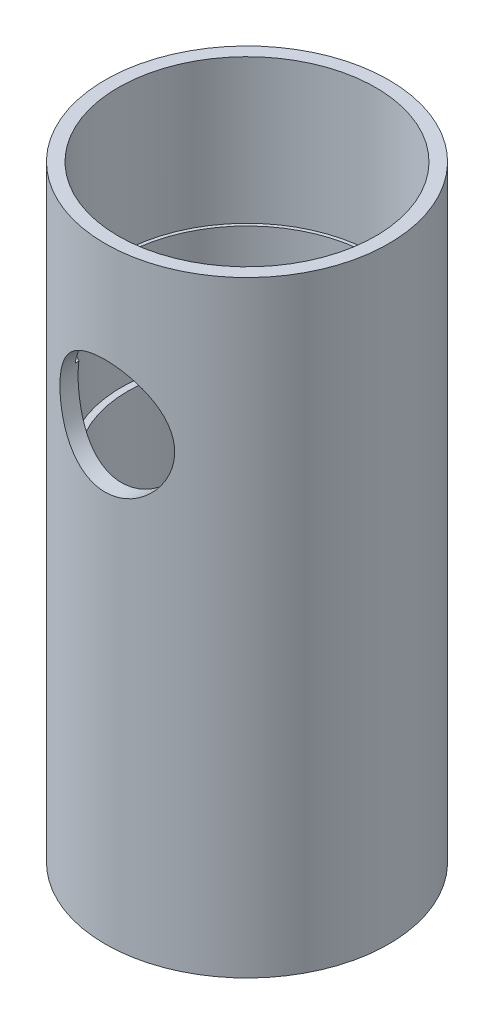
ISO-10303-21;
HEADER;
FILE_DESCRIPTION(('STEP AP214'),'2;1');
FILE_NAME('part.step','',(''),(''),'','','');
FILE_SCHEMA(('AUTOMOTIVE_DESIGN { 1 0 10303 214 1 1 1 1 }'));
ENDSEC;
DATA;
#1=APPLICATION_CONTEXT('core data for automotive mechanical design processes');
#2=APPLICATION_PROTOCOL_DEFINITION('international standard','automotive_design',2000,#1);
#3=PRODUCT_CONTEXT('',#1,'mechanical');
#4=PRODUCT('Part','Part','',(#3));
#5=PRODUCT_RELATED_PRODUCT_CATEGORY('part','',(#4));
#6=PRODUCT_DEFINITION_FORMATION('','',#4);
#7=PRODUCT_DEFINITION_CONTEXT('part definition',#1,'design');
#8=PRODUCT_DEFINITION('design','',#6,#7);
#9=PRODUCT_DEFINITION_SHAPE('','',#8);
#10=(LENGTH_UNIT() NAMED_UNIT(*) SI_UNIT(.MILLI.,.METRE.));
#11=(NAMED_UNIT(*) PLANE_ANGLE_UNIT() SI_UNIT($,.RADIAN.));
#12=(NAMED_UNIT(*) SI_UNIT($,.STERADIAN.) SOLID_ANGLE_UNIT());
#13=UNCERTAINTY_MEASURE_WITH_UNIT(LENGTH_MEASURE(1.E-05),#10,'distance_accuracy_value','');
#14=(GEOMETRIC_REPRESENTATION_CONTEXT(3) GLOBAL_UNCERTAINTY_ASSIGNED_CONTEXT((#13)) GLOBAL_UNIT_ASSIGNED_CONTEXT((#10,
#11,#12)) REPRESENTATION_CONTEXT('',''));
#15=CARTESIAN_POINT('',(0.,0.,0.));
#16=DIRECTION('',(0.,0.,1.));
#17=DIRECTION('',(1.,0.,0.));
#18=AXIS2_PLACEMENT_3D('',#15,#16,#17);
#19=CARTESIAN_POINT('',(0.,92.5,0.));
#20=DIRECTION('',(0.,-1.,0.));
#21=DIRECTION('',(0.,0.,-1.));
#22=AXIS2_PLACEMENT_3D('',#19,#20,#21);
#23=CYLINDRICAL_SURFACE('',#22,38.25);
#24=CARTESIAN_POINT('',(0.,13.85,0.));
#25=DIRECTION('',(0.,-1.,0.));
#26=DIRECTION('',(0.,0.,-1.));
#27=AXIS2_PLACEMENT_3D('',#24,#25,#26);
#28=CIRCLE('',#27,38.25);
#29=CARTESIAN_POINT('',(0.,13.85,-38.25));
#30=VERTEX_POINT('',#29);
#31=EDGE_CURVE('E132',#30,#30,#28,.T.);
#32=ORIENTED_EDGE('',*,*,#31,.T.);
#33=EDGE_LOOP('',(#32));
#34=FACE_BOUND('',#33,.T.);
#35=CARTESIAN_POINT('',(-17.5,44.35,34.0119464306293));
#36=CARTESIAN_POINT('',(-17.4999963559467,43.8880913442429,34.0119506664495));
#37=CARTESIAN_POINT('',(-17.4816862528908,43.4260752217071,34.021388664164));
#38=CARTESIAN_POINT('',(-17.4086531428424,42.5054925467613,34.0588156311859));
#39=CARTESIAN_POINT('',(-17.3539095107351,42.0469280971404,34.0868151081592));
#40=CARTESIAN_POINT('',(-17.20851698295,41.1359462215661,34.1604461910333));
#41=CARTESIAN_POINT('',(-17.1177907569354,40.6835442195852,34.2061157666125));
#42=CARTESIAN_POINT('',(-16.9014986113391,39.7891870432965,34.3135015038469));
#43=CARTESIAN_POINT('',(-16.775937130218,39.3472305458766,34.3752156211576));
#44=CARTESIAN_POINT('',(-16.491940210336,38.4785641197131,34.5123619099827));
#45=CARTESIAN_POINT('',(-16.3336609382015,38.0517926584907,34.5877287113605));
#46=CARTESIAN_POINT('',(-15.9852985840025,37.2137421343052,34.7501026320442));
#47=CARTESIAN_POINT('',(-15.7952145786735,36.8024635215112,34.8371100892538));
#48=CARTESIAN_POINT('',(-15.3847994020611,35.9976393662047,35.0202927266738));
#49=CARTESIAN_POINT('',(-15.1644794777891,35.6040873018197,35.1164644939415));
#50=CARTESIAN_POINT('',(-14.6949265290166,34.8362338137703,35.3155301741502));
#51=CARTESIAN_POINT('',(-14.4456829292706,34.4619395038932,35.418426539734));
#52=CARTESIAN_POINT('',(-13.901798714917,33.7095139370608,35.6355716260521));
#53=CARTESIAN_POINT('',(-13.6052199343816,33.3328676748125,35.7501156542786));
#54=CARTESIAN_POINT('',(-12.9824758840449,32.6054445347668,35.9809405980139));
#55=CARTESIAN_POINT('',(-12.6563092842936,32.2546688211172,36.0972215914015));
#56=CARTESIAN_POINT('',(-11.9759054472455,31.5806172757582,36.3286301293952));
#57=CARTESIAN_POINT('',(-11.6216516666003,31.2573578870872,36.4437569485488));
#58=CARTESIAN_POINT('',(-10.8871595055014,30.6405261583241,36.6698766613492));
#59=CARTESIAN_POINT('',(-10.5069300314308,30.3469437275469,36.7808709519642));
#60=CARTESIAN_POINT('',(-9.70088261864598,29.7760551766963,37.0018830903801));
#61=CARTESIAN_POINT('',(-9.27370935984373,29.5005095937366,37.1115176444699));
#62=CARTESIAN_POINT('',(-8.39500376757391,28.9866359164881,37.3201058526642));
#63=CARTESIAN_POINT('',(-7.94347030495647,28.7483095493907,37.4190590110231));
#64=CARTESIAN_POINT('',(-7.0191860571498,28.3112271998349,37.6033970594537));
#65=CARTESIAN_POINT('',(-6.54644408173958,28.1124549701577,37.688787517606));
#66=CARTESIAN_POINT('',(-5.58300581820605,27.7565163353947,37.843499917249));
#67=CARTESIAN_POINT('',(-5.09231108758356,27.599346330782,37.9128232488425));
#68=CARTESIAN_POINT('',(-4.12736407425427,27.3367886022416,38.0295794445507));
#69=CARTESIAN_POINT('',(-3.65394415230237,27.2288198985413,38.0780925957465));
#70=CARTESIAN_POINT('',(-2.69833889926815,27.0524569985339,38.1577159199203));
#71=CARTESIAN_POINT('',(-2.21615389672074,26.9840613220825,38.1888267437935));
#72=CARTESIAN_POINT('',(-1.24713311969708,26.887708130059,38.2327385580087));
#73=CARTESIAN_POINT('',(-0.760299383326491,26.8597336447286,38.2455472319948));
#74=CARTESIAN_POINT('',(0.214127080405577,26.8445281030407,38.252503042635));
#75=CARTESIAN_POINT('',(0.701719769629707,26.857295061541,38.2466510885352));
#76=CARTESIAN_POINT('',(1.63794827502845,26.9209750749321,38.2175706486073));
#77=CARTESIAN_POINT('',(2.08682276991367,26.9690270252225,38.195645664213));
#78=CARTESIAN_POINT('',(2.97850633690051,27.0994491699875,38.1364736633821));
#79=CARTESIAN_POINT('',(3.42131576327129,27.1818173510972,38.0992275458522));
#80=CARTESIAN_POINT('',(4.29790002818107,27.3800264657815,38.0103231533736));
#81=CARTESIAN_POINT('',(4.73167456776198,27.4958685051023,37.9586644023325));
#82=CARTESIAN_POINT('',(5.58743901915592,27.7599108464584,37.8421660336359));
#83=CARTESIAN_POINT('',(6.00942854248799,27.9081122137691,37.7773259820543));
#84=CARTESIAN_POINT('',(6.84537871302673,28.2380251032218,37.634900949758));
#85=CARTESIAN_POINT('',(7.25912350396186,28.4202065999706,37.5571391360573));
#86=CARTESIAN_POINT('',(8.06963496377364,28.8150645145304,37.3913709481213));
#87=CARTESIAN_POINT('',(8.46640161545906,29.0277409632182,37.3033645635132));
#88=CARTESIAN_POINT('',(9.24100862879509,29.4820682050667,37.1190623150115));
#89=CARTESIAN_POINT('',(9.61884689238814,29.7237222001222,37.0227655353969));
#90=CARTESIAN_POINT('',(10.3539283889975,30.2345268510235,36.8239557703178));
#91=CARTESIAN_POINT('',(10.71116354302,30.5036881800363,36.7214403782775));
#92=CARTESIAN_POINT('',(11.4317970140629,31.0911343626418,36.5038297132035));
#93=CARTESIAN_POINT('',(11.793285206611,31.4116387629867,36.3883932945842));
#94=CARTESIAN_POINT('',(12.4882737868146,32.0811025036426,36.1557718247314));
#95=CARTESIAN_POINT('',(12.8217729826686,32.4300630544008,36.0385866992862));
#96=CARTESIAN_POINT('',(13.4591659088613,33.1547417047956,35.8054266283037));
#97=CARTESIAN_POINT('',(13.763045772817,33.5304721957403,35.6894522720613));
#98=CARTESIAN_POINT('',(14.3393107963241,34.3067006883469,35.4618481747671));
#99=CARTESIAN_POINT('',(14.6116908442901,34.7072026936304,35.3502191407903));
#100=CARTESIAN_POINT('',(15.1350420910708,35.5501188824437,35.1294378489425));
#101=CARTESIAN_POINT('',(15.3844237801989,35.9936164953495,35.0206435191974));
#102=CARTESIAN_POINT('',(15.8444520886495,36.9026715343298,34.8149298798515));
#103=CARTESIAN_POINT('',(16.0551161553594,37.3682189045431,34.7180052280005));
#104=CARTESIAN_POINT('',(16.4356468091265,38.3183141450329,34.5394876659152));
#105=CARTESIAN_POINT('',(16.6055326817103,38.8028529069402,34.4578875121443));
#106=CARTESIAN_POINT('',(16.9026097646004,39.787528414958,34.3131411977795));
#107=CARTESIAN_POINT('',(17.029805741641,40.2876634127794,34.2499929769532));
#108=CARTESIAN_POINT('',(17.2321089184638,41.2623276484984,34.1486274721599));
#109=CARTESIAN_POINT('',(17.3103458644518,41.7360536675629,34.1089243595417));
#110=CARTESIAN_POINT('',(17.4276683930875,42.6895615289902,34.0491299368436));
#111=CARTESIAN_POINT('',(17.4667559403786,43.1693430662436,34.0290376426306));
#112=CARTESIAN_POINT('',(17.5052351750496,44.1307149875237,34.0092592012842));
#113=CARTESIAN_POINT('',(17.5046433999896,44.6123045343234,34.0095645528135));
#114=CARTESIAN_POINT('',(17.4638118990851,45.5733380872262,34.0305496011318));
#115=CARTESIAN_POINT('',(17.4235739496021,46.0527821884899,34.0512283850816));
#116=CARTESIAN_POINT('',(17.309055670128,46.9653265412588,34.1095703603796));
#117=CARTESIAN_POINT('',(17.2379281524015,47.3989288715477,34.1456562722161));
#118=CARTESIAN_POINT('',(17.0636810912043,48.2580534700188,34.2330655885092));
#119=CARTESIAN_POINT('',(16.9605637174625,48.683576284122,34.2843879595348));
#120=CARTESIAN_POINT('',(16.7233373861755,49.5240420536338,34.4007254670964));
#121=CARTESIAN_POINT('',(16.5892223558757,49.9389829182219,34.465743286488));
#122=CARTESIAN_POINT('',(16.2911962545417,50.7559356728497,34.6076095495017));
#123=CARTESIAN_POINT('',(16.1272835770774,51.157946864458,34.6844586309285));
#124=CARTESIAN_POINT('',(15.762851551221,51.9649400511151,34.8516424883733));
#125=CARTESIAN_POINT('',(15.5610094728006,52.3692304119257,34.9424307083692));
#126=CARTESIAN_POINT('',(15.1275627478024,53.159659483121,35.1322546998847));
#127=CARTESIAN_POINT('',(14.895948007953,53.5457919768684,35.2312932643392));
#128=CARTESIAN_POINT('',(14.4044026173398,54.2981222844981,35.4351022377629));
#129=CARTESIAN_POINT('',(14.1444652962768,54.6643153718305,35.5398739940611));
#130=CARTESIAN_POINT('',(13.597734127213,55.3750935035387,35.7526247077884));
#131=CARTESIAN_POINT('',(13.3109386934208,55.7196772700209,35.8606038543352));
#132=CARTESIAN_POINT('',(12.681279820113,56.419748172919,36.0883754816956));
#133=CARTESIAN_POINT('',(12.3356815796355,56.7727548163299,36.2082482018894));
#134=CARTESIAN_POINT('',(11.6155739763227,57.4485570094439,36.445639218644));
#135=CARTESIAN_POINT('',(11.2410731278414,57.7713613948378,36.5631581958371));
#136=CARTESIAN_POINT('',(10.4649052499345,58.3849767202565,36.7928265826875));
#137=CARTESIAN_POINT('',(10.0632277968393,58.6757752707249,36.9049739035385));
#138=CARTESIAN_POINT('',(9.23504444539116,59.2231406075298,37.1208775840716));
#139=CARTESIAN_POINT('',(8.80853899482235,59.479708010966,37.2246340950053));
#140=CARTESIAN_POINT('',(7.92788243169253,59.9593914161008,37.4221489988458));
#141=CARTESIAN_POINT('',(7.47345910216024,60.1820647503238,37.5157711158276));
#142=CARTESIAN_POINT('',(6.54471404569609,60.588027572523,37.6888884578691));
#143=CARTESIAN_POINT('',(6.0703919101935,60.7713162513633,37.7683833926879));
#144=CARTESIAN_POINT('',(5.10561944786912,61.0963904863029,37.910852664795));
#145=CARTESIAN_POINT('',(4.61517895864838,61.2382008533949,37.9738368759178));
#146=CARTESIAN_POINT('',(3.62187412247236,61.4787207673477,38.0814124929362));
#147=CARTESIAN_POINT('',(3.11901096032005,61.5774344078859,38.1260056457417));
#148=CARTESIAN_POINT('',(2.14638320656821,61.7242612945539,38.1925851993499));
#149=CARTESIAN_POINT('',(1.67724282862606,61.775829736532,38.2161120488745));
#150=CARTESIAN_POINT('',(0.735790699627969,61.8408893131703,38.2458214160703));
#151=CARTESIAN_POINT('',(0.26347913013708,61.8543826094813,38.2520049183801));
#152=CARTESIAN_POINT('',(-0.680484994633248,61.8431331039671,38.2468585118149));
#153=CARTESIAN_POINT('',(-1.15213766993137,61.8183985359721,38.2355323743092));
#154=CARTESIAN_POINT('',(-2.09117464797779,61.7310049769839,38.1956845806039));
#155=CARTESIAN_POINT('',(-2.55855901321341,61.6683465420959,38.167163176551));
#156=CARTESIAN_POINT('',(-3.46271231395203,61.5098323735705,38.095506628578));
#157=CARTESIAN_POINT('',(-3.89985779073242,61.415757430995,38.0531576666131));
#158=CARTESIAN_POINT('',(-4.76418990309939,61.1949234462654,37.9546332337892));
#159=CARTESIAN_POINT('',(-5.1913769650185,61.0681658061119,37.8984583560299));
#160=CARTESIAN_POINT('',(-6.03324513803095,60.7831216299403,37.7735831037878));
#161=CARTESIAN_POINT('',(-6.44792496370272,60.6248318658598,37.7048814469523));
#162=CARTESIAN_POINT('',(-7.26242632806549,60.2780603560884,37.5565048507993));
#163=CARTESIAN_POINT('',(-7.66224720712905,60.0895772720048,37.4768294250647));
#164=CARTESIAN_POINT('',(-8.4628414588937,59.6745808548154,37.3043971566103));
#165=CARTESIAN_POINT('',(-8.86282572776573,59.4467245827027,37.2112092843919));
#166=CARTESIAN_POINT('',(-9.64224493691484,58.9612265364238,37.0169010222635));
#167=CARTESIAN_POINT('',(-10.0216794163264,58.7035840946558,36.9157804545732));
#168=CARTESIAN_POINT('',(-10.758244284821,58.1601296338563,36.7078894559219));
#169=CARTESIAN_POINT('',(-11.115371342148,57.8743134232493,36.6011181853706));
#170=CARTESIAN_POINT('',(-11.8057793845762,57.2760334445466,36.3842971345063));
#171=CARTESIAN_POINT('',(-12.1390490915459,56.963557224412,36.2742458379853));
#172=CARTESIAN_POINT('',(-12.8069523300861,56.286360852688,36.04413233095));
#173=CARTESIAN_POINT('',(-13.1393533464089,55.919457024506,35.924005031566));
#174=CARTESIAN_POINT('',(-13.7721051743918,55.158509824932,35.686213514932));
#175=CARTESIAN_POINT('',(-14.072468991247,54.7644775737736,35.5685483139287));
#176=CARTESIAN_POINT('',(-14.6396877275561,53.9508179960435,35.3388705974869));
#177=CARTESIAN_POINT('',(-14.9065102408845,53.5311664899287,35.2268636103007));
#178=CARTESIAN_POINT('',(-15.4043415027105,52.6688982693917,35.0120306476242));
#179=CARTESIAN_POINT('',(-15.635352231922,52.2262828268904,34.9092041645029));
#180=CARTESIAN_POINT('',(-16.061563988274,51.3164097651568,34.7151845771257));
#181=CARTESIAN_POINT('',(-16.2564112221681,50.8489609353728,34.6241088211891));
#182=CARTESIAN_POINT('',(-16.6056085420832,49.8962728524367,34.4579992606797));
#183=CARTESIAN_POINT('',(-16.7599517642907,49.4110305998679,34.3829681754366));
#184=CARTESIAN_POINT('',(-17.0258189168141,48.4279902257286,34.2520935603068));
#185=CARTESIAN_POINT('',(-17.1374690474513,47.9302338185339,34.1961935314704));
#186=CARTESIAN_POINT('',(-17.3169946495662,46.9252459958501,34.1056361028406));
#187=CARTESIAN_POINT('',(-17.3849024824244,46.4180218712932,34.0709629999093));
#188=CARTESIAN_POINT('',(-17.4536197121235,45.6495470976487,34.035778481114));
#189=CARTESIAN_POINT('',(-17.4710034829643,45.3900447941061,34.0268526275942));
#190=CARTESIAN_POINT('',(-17.4941948743711,44.8703730446712,34.0149352959514));
#191=CARTESIAN_POINT('',(-17.5000020527775,44.6102035736769,34.0119440444962));
#192=CARTESIAN_POINT('',(-17.5,44.35,34.0119464306293));
#193=B_SPLINE_CURVE_WITH_KNOTS('',3,(#35,#36,#37,#38,#39,#40,#41,#42,#43,#44,#45,#46,#47,#48,
#49,#50,#51,#52,#53,#54,#55,#56,#57,#58,#59,#60,#61,#62,#63,#64,#65,#66,#67,#68,#69,#70,#71,#72,
#73,#74,#75,#76,#77,#78,#79,#80,#81,#82,#83,#84,#85,#86,#87,#88,#89,#90,#91,#92,#93,#94,#95,#96,
#97,#98,#99,#100,#101,#102,#103,#104,#105,#106,#107,#108,#109,#110,#111,#112,#113,#114,#115,
#116,#117,#118,#119,#120,#121,#122,#123,#124,#125,#126,#127,#128,#129,#130,#131,#132,#133,#134,
#135,#136,#137,#138,#139,#140,#141,#142,#143,#144,#145,#146,#147,#148,#149,#150,#151,#152,#153,
#154,#155,#156,#157,#158,#159,#160,#161,#162,#163,#164,#165,#166,#167,#168,#169,#170,#171,#172,
#173,#174,#175,#176,#177,#178,#179,#180,#181,#182,#183,#184,#185,#186,#187,#188,#189,#190,#191,
#192),.UNSPECIFIED.,.T.,.F.,(4,2,2,2,2,2,2,2,2,2,2,2,2,2,2,2,2,2,2,2,2,2,2,2,2,2,2,2,2,2,2,2,2,
2,2,2,2,2,2,2,2,2,2,2,2,2,2,2,2,2,2,2,2,2,2,2,2,2,2,2,2,2,2,2,2,2,2,2,2,2,2,2,2,2,2,2,2,2,4),
(0.,1.38545698350106,2.77169894566746,4.16093637114373,5.54999687108591,6.93257425744101,
8.31519178581331,9.69729640178114,11.079907952706,12.5569815830858,14.0341216397391,
15.512138289092,16.9896506844579,18.5477323323933,20.1058862630475,21.6633988407494,
23.2207766145476,24.6828153496587,26.144799396813,27.6061694904768,29.0674683794145,
30.4217855122794,31.7760231972897,33.1303056221171,34.484632636907,35.8593056689495,
37.2339800928855,38.6088065526666,39.984168501266,41.472662506229,42.9612198607378,
44.450470774236,45.9399630155934,47.4988772988709,49.0570873542461,50.6145590156321,
52.1718567125371,53.6152349215511,55.0585406935499,56.501244927868,57.9438845242342,
59.2650124724778,60.5860508340992,61.9073482202015,63.2287168603122,64.6099927944072,
65.9917382378938,67.3738098048652,68.7559630254115,70.2792723124474,71.8021345516888,
73.3255842374297,74.8490064555753,76.3908751987151,77.9327756156674,79.4737518222606,
81.014581622542,82.4304160809934,83.8461701562694,85.2616193373416,86.677047763154,
88.0229877856872,89.3688700805831,90.7148902293954,92.0609700603542,93.4684753132993,
94.8760121189869,96.2837586490839,97.6921663303462,99.2187648322028,100.744741248342,
102.272180845473,103.799535931281,105.341125230782,106.882975599703,108.420232378321,
109.956350555053,110.736779944082,111.517239140483),.UNSPECIFIED.);
#194=CARTESIAN_POINT('',(-17.0008088042893,48.5,34.2641941390718));
#195=VERTEX_POINT('',#194);
#196=CARTESIAN_POINT('',(17.0008088042893,48.5,34.2641941390718));
#197=VERTEX_POINT('',#196);
#198=EDGE_CURVE('E75',#195,#197,#193,.T.);
#199=ORIENTED_EDGE('',*,*,#198,.T.);
#200=CARTESIAN_POINT('',(0.,48.5,0.));
#201=DIRECTION('',(0.,1.,0.));
#202=DIRECTION('',(0.,0.,1.));
#203=AXIS2_PLACEMENT_3D('',#200,#201,#202);
#204=CIRCLE('',#203,38.25);
#205=EDGE_CURVE('E63',#197,#195,#204,.T.);
#206=ORIENTED_EDGE('',*,*,#205,.T.);
#207=EDGE_LOOP('',(#199,#206));
#208=FACE_BOUND('',#207,.T.);
#209=ADVANCED_FACE('F39',(#34,#208),#23,.F.);
#210=CARTESIAN_POINT('',(0.,44.35,43.25));
#211=DIRECTION('',(0.,0.,-1.));
#212=DIRECTION('',(-1.,0.,0.));
#213=AXIS2_PLACEMENT_3D('',#210,#211,#212);
#214=CYLINDRICAL_SURFACE('',#213,17.5);
#215=CARTESIAN_POINT('',(0.,26.85,43.25));
#216=CARTESIAN_POINT('',(0.470059434277367,26.850002844216,43.2499977648821));
#217=CARTESIAN_POINT('',(0.940294062765784,26.8689650815116,43.242315552243));
#218=CARTESIAN_POINT('',(1.87743082592684,26.9446417731732,43.211778779537));
#219=CARTESIAN_POINT('',(2.34433056223458,27.0013810792809,43.1889142317585));
#220=CARTESIAN_POINT('',(3.27227048018818,27.1522183293541,43.1285451481035));
#221=CARTESIAN_POINT('',(3.73329381704013,27.24640603052,43.0910054421133));
#222=CARTESIAN_POINT('',(4.64493934781961,27.4711689672634,43.0022881934933));
#223=CARTESIAN_POINT('',(5.09556320935262,27.6017383243465,42.9511128541476));
#224=CARTESIAN_POINT('',(5.98200699968892,27.8975472167294,42.8366335919219));
#225=CARTESIAN_POINT('',(6.41787076643723,28.062671242022,42.7733701371742));
#226=CARTESIAN_POINT('',(7.27364607323426,28.4264242902271,42.6361865097981));
#227=CARTESIAN_POINT('',(7.69355701410011,28.625054570102,42.5622659373908));
#228=CARTESIAN_POINT('',(8.5147325029693,29.0541241803067,42.4056182956549));
#229=CARTESIAN_POINT('',(8.91600820300399,29.28454414988,42.3228965934096));
#230=CARTESIAN_POINT('',(9.69816737601018,29.7757448603038,42.1505457868008));
#231=CARTESIAN_POINT('',(10.0790428123304,30.0365374398211,42.0609139936476));
#232=CARTESIAN_POINT('',(10.8343968901387,30.5987437432511,41.8728593952449));
#233=CARTESIAN_POINT('',(11.2078742027632,30.9014320696689,41.7742237278819));
#234=CARTESIAN_POINT('',(11.9282904328624,31.536087355285,41.5742488793874));
#235=CARTESIAN_POINT('',(12.2752284239501,31.8680553356549,41.4729096040497));
#236=CARTESIAN_POINT('',(12.9407913246801,32.5594839715228,41.2700801175748));
#237=CARTESIAN_POINT('',(13.2594048230751,32.9189556000249,41.1685898622032));
#238=CARTESIAN_POINT('',(13.8663734349416,33.6633556892427,40.9681385478603));
#239=CARTESIAN_POINT('',(14.1547237412418,34.0482881785177,40.8691778925874));
#240=CARTESIAN_POINT('',(14.7118577265007,34.8597699571218,40.6720426858552));
#241=CARTESIAN_POINT('',(14.9791292444083,35.2874193633521,40.5741141137364));
#242=CARTESIAN_POINT('',(15.4763768145114,36.1654895559165,40.3870626977386));
#243=CARTESIAN_POINT('',(15.7063682359944,36.6159008573367,40.2979362310091));
#244=CARTESIAN_POINT('',(16.1271539384876,37.5366984820836,40.1313921632747));
#245=CARTESIAN_POINT('',(16.3179543644506,38.0070816599415,40.0539727271687));
#246=CARTESIAN_POINT('',(16.6584905254094,38.9645730845136,39.9135461941763));
#247=CARTESIAN_POINT('',(16.8082291220181,39.4516801630702,39.85053809301));
#248=CARTESIAN_POINT('',(17.05904913232,40.4161051724473,39.7437927605097));
#249=CARTESIAN_POINT('',(17.1620557454882,40.8928388462224,39.6993009203272));
#250=CARTESIAN_POINT('',(17.328026130822,41.8544935024117,39.627140145584));
#251=CARTESIAN_POINT('',(17.3909910786943,42.3394142440074,39.5994707170832));
#252=CARTESIAN_POINT('',(17.4761003471459,43.3133024504649,39.5619841425426));
#253=CARTESIAN_POINT('',(17.4982624769182,43.8022680562117,39.5521592079475));
#254=CARTESIAN_POINT('',(17.5015406934382,44.7803520513256,39.550709122454));
#255=CARTESIAN_POINT('',(17.4826587602059,45.2694704321846,39.5590830936164));
#256=CARTESIAN_POINT('',(17.4069126294781,46.2088429713542,39.5924666556732));
#257=CARTESIAN_POINT('',(17.3528654886494,46.6593717558863,39.616241887769));
#258=CARTESIAN_POINT('',(17.2101817936726,47.5538634614433,39.678434872842));
#259=CARTESIAN_POINT('',(17.1215471446506,47.9978267427071,39.7168518193313));
#260=CARTESIAN_POINT('',(16.9105484982901,48.8763072272052,39.8071474899506));
#261=CARTESIAN_POINT('',(16.7881801649869,49.310823208378,39.8590279445647));
#262=CARTESIAN_POINT('',(16.5108262606456,50.167681839503,39.9747128613793));
#263=CARTESIAN_POINT('',(16.3558394754305,50.5900240356373,40.0385177674413));
#264=CARTESIAN_POINT('',(16.0110002279462,51.4286761037803,40.1776757417442));
#265=CARTESIAN_POINT('',(15.8204951618841,51.8446823687218,40.2532396700456));
#266=CARTESIAN_POINT('',(15.4082820241698,52.6592245996199,40.4128218147288));
#267=CARTESIAN_POINT('',(15.1865738102808,53.0577604859284,40.4968400696483));
#268=CARTESIAN_POINT('',(14.7133734515888,53.8354567600271,40.6711533374526));
#269=CARTESIAN_POINT('',(14.4618722421681,54.21461120046,40.7614502571728));
#270=CARTESIAN_POINT('',(13.9306447464836,54.9515799217684,40.9460462107693));
#271=CARTESIAN_POINT('',(13.6509169661793,55.3093930714467,41.0403454563368));
#272=CARTESIAN_POINT('',(13.0414265505587,56.02951364981,41.2382629032203));
#273=CARTESIAN_POINT('',(12.7094537521764,56.3899136734192,41.3420256165126));
#274=CARTESIAN_POINT('',(12.016492967026,57.0815933228605,41.5487311593366));
#275=CARTESIAN_POINT('',(11.6555164524246,57.4128843550012,41.6516742955086));
#276=CARTESIAN_POINT('',(10.9063084669352,58.0446203183379,41.8540982974705));
#277=CARTESIAN_POINT('',(10.5180651622934,58.3450517154518,41.9535776316081));
#278=CARTESIAN_POINT('',(9.71667748219643,58.9128752070573,42.1463937721416));
#279=CARTESIAN_POINT('',(9.30353322224622,59.1802674547862,42.2397306070256));
#280=CARTESIAN_POINT('',(8.44596708696948,59.6851985955382,42.4196180657154));
#281=CARTESIAN_POINT('',(8.00107428827262,59.9220034894991,42.5059878411286));
#282=CARTESIAN_POINT('',(7.09078391371717,60.3570372814059,42.6672815337763));
#283=CARTESIAN_POINT('',(6.62538585991636,60.5552652796069,42.7422051840391));
#284=CARTESIAN_POINT('',(5.67759167941603,60.9111312833959,42.8783924764108));
#285=CARTESIAN_POINT('',(5.19520279315625,61.0687863463359,42.9396618574823));
#286=CARTESIAN_POINT('',(4.21695657454259,61.3419130834324,43.0467397188671));
#287=CARTESIAN_POINT('',(3.7211002020085,61.4573877553292,43.0925492978836));
#288=CARTESIAN_POINT('',(2.75020559605459,61.6391693672073,43.1650481182577));
#289=CARTESIAN_POINT('',(2.27571658022925,61.7080226662511,43.1927242964743));
#290=CARTESIAN_POINT('',(1.3220420187623,61.8065738855666,43.2324232768283));
#291=CARTESIAN_POINT('',(0.842856662639657,61.8362733793737,43.2444467080269));
#292=CARTESIAN_POINT('',(-0.116354639928117,61.8561857342568,43.2525023411747));
#293=CARTESIAN_POINT('',(-0.596380365922478,61.8464077413418,43.2485382470592));
#294=CARTESIAN_POINT('',(-1.55360698058764,61.7874949093838,43.2247382862753));
#295=CARTESIAN_POINT('',(-2.03080792552573,61.7383608569562,43.2049027368322));
#296=CARTESIAN_POINT('',(-2.95673378052891,61.6044582525519,43.1511908786069));
#297=CARTESIAN_POINT('',(-3.40575429504911,61.5214445609101,43.118007041868));
#298=CARTESIAN_POINT('',(-4.29481814431909,61.3209218495559,43.0385434003731));
#299=CARTESIAN_POINT('',(-4.7348618257027,61.2034141645105,42.9922641023187));
#300=CARTESIAN_POINT('',(-5.60318875804309,60.9349576580756,42.8877377037914));
#301=CARTESIAN_POINT('',(-6.03147109833955,60.7840062553564,42.8294896795458));
#302=CARTESIAN_POINT('',(-6.8736747180743,60.4499331227533,42.7024178840039));
#303=CARTESIAN_POINT('',(-7.28759548814101,60.266810253216,42.6335937380661));
#304=CARTESIAN_POINT('',(-8.11120757133792,59.8637013041062,42.4847181864237));
#305=CARTESIAN_POINT('',(-8.52037852079317,59.6427557671346,42.4043868747247));
#306=CARTESIAN_POINT('',(-9.31870866519969,59.1698158329657,42.2361292412104));
#307=CARTESIAN_POINT('',(-9.7078675870692,58.9178210122328,42.148202815797));
#308=CARTESIAN_POINT('',(-10.4642029711473,58.3844091352346,41.9668230084931));
#309=CARTESIAN_POINT('',(-10.8313754583454,58.1029867837612,41.8733686332185));
#310=CARTESIAN_POINT('',(-11.5419259587758,57.5123505490372,41.6831115687275));
#311=CARTESIAN_POINT('',(-11.885295397412,57.2031267420319,41.5863076915489));
#312=CARTESIAN_POINT('',(-12.5686708075017,56.5369312254383,41.3850974807289));
#313=CARTESIAN_POINT('',(-12.9068899517914,56.1781460020152,41.2806185295181));
#314=CARTESIAN_POINT('',(-13.5520961351205,55.4330315158437,41.073325245266));
#315=CARTESIAN_POINT('',(-13.8590812685067,55.0467005749155,40.9705110141142));
#316=CARTESIAN_POINT('',(-14.4399610535917,54.2485465391662,40.7694070429601));
#317=CARTESIAN_POINT('',(-14.7138427053217,53.8367135248977,40.6711190897773));
#318=CARTESIAN_POINT('',(-15.2263283875827,52.9902320251575,40.4820456971393));
#319=CARTESIAN_POINT('',(-15.4649465553332,52.5555927779774,40.3912572575834));
#320=CARTESIAN_POINT('',(-15.9075853310841,51.660987814311,40.2190041915652));
#321=CARTESIAN_POINT('',(-16.1111893612872,51.2007932934099,40.1376551394433));
#322=CARTESIAN_POINT('',(-16.4785976805825,50.2626615901637,39.9882194615447));
#323=CARTESIAN_POINT('',(-16.6424013835439,49.7847241466419,39.9201330310867));
#324=CARTESIAN_POINT('',(-16.9283732359771,48.8149269365687,39.7997082344541));
#325=CARTESIAN_POINT('',(-17.0505678719415,48.3230762433826,39.7473598526283));
#326=CARTESIAN_POINT('',(-17.2520102640288,47.3291272372655,39.6603421243688));
#327=CARTESIAN_POINT('',(-17.3312617351412,46.8270298146743,39.6256712486793));
#328=CARTESIAN_POINT('',(-17.4416112219964,45.8540117934851,39.577215905536));
#329=CARTESIAN_POINT('',(-17.475817182458,45.3835084238347,39.5620849711273));
#330=CARTESIAN_POINT('',(-17.5061121131864,44.4410460469658,39.5486894074129));
#331=CARTESIAN_POINT('',(-17.5022030296309,43.9690871152992,39.5504239169474));
#332=CARTESIAN_POINT('',(-17.4563185034596,43.0274539859397,39.5706969814817));
#333=CARTESIAN_POINT('',(-17.4143477435348,42.5577795143379,39.5892334693502));
#334=CARTESIAN_POINT('',(-17.2928270893453,41.6242546690589,39.6424648284504));
#335=CARTESIAN_POINT('',(-17.2132774009697,41.1604042634868,39.6771596111532));
#336=CARTESIAN_POINT('',(-17.0215379900631,40.2610112499345,39.7597804030315));
#337=CARTESIAN_POINT('',(-16.9108404084966,39.8250928841698,39.8070973271153));
#338=CARTESIAN_POINT('',(-16.65675359561,38.9644766117882,39.9140832510825));
#339=CARTESIAN_POINT('',(-16.5133655575086,38.5397782962648,39.9737518001177));
#340=CARTESIAN_POINT('',(-16.1950943522642,37.704032465471,40.1037522229892));
#341=CARTESIAN_POINT('',(-16.0202096486718,37.2929856172964,40.1740846169956));
#342=CARTESIAN_POINT('',(-15.6402019215587,36.4866142793651,40.3235447841811));
#343=CARTESIAN_POINT('',(-15.4350679038814,36.0912955726383,40.4026757526318));
#344=CARTESIAN_POINT('',(-14.9832551308622,35.2960996129921,40.5724797337683));
#345=CARTESIAN_POINT('',(-14.7348584529602,34.897284097535,40.6635557748369));
#346=CARTESIAN_POINT('',(-14.207459510504,34.1217039644758,40.8508124733559));
#347=CARTESIAN_POINT('',(-13.92845624186,33.7449400709286,40.9469932982221));
#348=CARTESIAN_POINT('',(-13.3413875548945,33.0152418045547,41.1420170461912));
#349=CARTESIAN_POINT('',(-13.033309791695,32.6623176640744,41.2408610872392));
#350=CARTESIAN_POINT('',(-12.389993249649,31.9824196584947,41.4386748481155));
#351=CARTESIAN_POINT('',(-12.0547626320578,31.6554380539841,41.5376445214441));
#352=CARTESIAN_POINT('',(-11.3353786570621,31.0080053623813,41.7399147344887));
#353=CARTESIAN_POINT('',(-10.9494513062316,30.689472782613,41.8430588332582));
#354=CARTESIAN_POINT('',(-10.1508056809915,30.0860011681566,42.0439434678828));
#355=CARTESIAN_POINT('',(-9.73808581007938,29.8010641382015,42.1416836810896));
#356=CARTESIAN_POINT('',(-8.88813320582469,29.2667917404913,42.3291039645086));
#357=CARTESIAN_POINT('',(-8.45088746124,29.0174755235444,42.4187796894837));
#358=CARTESIAN_POINT('',(-7.55491682978528,28.5567436990427,42.5874802506419));
#359=CARTESIAN_POINT('',(-7.09619373624042,28.3453249342024,42.6665059739542));
#360=CARTESIAN_POINT('',(-6.16888932226305,27.9658242773945,42.8103192210252));
#361=CARTESIAN_POINT('',(-5.70063719331076,27.7970266103111,42.8753387708321));
#362=CARTESIAN_POINT('',(-4.74971895872982,27.4995296108421,42.9910694239837));
#363=CARTESIAN_POINT('',(-4.2670503977813,27.370837152102,43.0417780744381));
#364=CARTESIAN_POINT('',(-3.29253697619319,27.1553038258687,43.1272572015762));
#365=CARTESIAN_POINT('',(-2.80072207409969,27.068345121127,43.1620725400378));
#366=CARTESIAN_POINT('',(-1.81081580923627,26.9367889948241,43.2149135081823));
#367=CARTESIAN_POINT('',(-1.31272944388049,26.8921597704104,43.2329517425886));
#368=CARTESIAN_POINT('',(-0.678186142356613,26.8626187897994,43.2448956552269));
#369=CARTESIAN_POINT('',(-0.542603421824415,26.8578878531542,43.2468089024352));
#370=CARTESIAN_POINT('',(-0.271351999916106,26.8515780473008,43.2493613975927));
#371=CARTESIAN_POINT('',(-0.135683298514895,26.8499991790132,43.2500006451698));
#372=CARTESIAN_POINT('',(0.,26.85,43.25));
#373=B_SPLINE_CURVE_WITH_KNOTS('',3,(#215,#216,#217,#218,#219,#220,#221,#222,#223,#224,#225,
#226,#227,#228,#229,#230,#231,#232,#233,#234,#235,#236,#237,#238,#239,#240,#241,#242,#243,#244,
#245,#246,#247,#248,#249,#250,#251,#252,#253,#254,#255,#256,#257,#258,#259,#260,#261,#262,#263,
#264,#265,#266,#267,#268,#269,#270,#271,#272,#273,#274,#275,#276,#277,#278,#279,#280,#281,#282,
#283,#284,#285,#286,#287,#288,#289,#290,#291,#292,#293,#294,#295,#296,#297,#298,#299,#300,#301,
#302,#303,#304,#305,#306,#307,#308,#309,#310,#311,#312,#313,#314,#315,#316,#317,#318,#319,#320,
#321,#322,#323,#324,#325,#326,#327,#328,#329,#330,#331,#332,#333,#334,#335,#336,#337,#338,#339,
#340,#341,#342,#343,#344,#345,#346,#347,#348,#349,#350,#351,#352,#353,#354,#355,#356,#357,#358,
#359,#360,#361,#362,#363,#364,#365,#366,#367,#368,#369,#370,#371,#372),.UNSPECIFIED.,.T.,.F.,(4,
2,2,2,2,2,2,2,2,2,2,2,2,2,2,2,2,2,2,2,2,2,2,2,2,2,2,2,2,2,2,2,2,2,2,2,2,2,2,2,2,2,2,2,2,2,2,2,2,
2,2,2,2,2,2,2,2,2,2,2,2,2,2,2,2,2,2,2,2,2,2,2,2,2,2,2,2,2,4),(0.,1.41003924077488,
2.82100699721751,4.23537718077374,5.64951896487065,7.05900695580351,8.4685478344061,
9.87723402424712,11.2864711425781,12.7570940385578,14.2277682449995,15.6990322902275,
17.1705296865129,18.7097780994274,20.2483903108289,21.7867610910347,23.325024634399,
24.792359692957,26.2596516655098,27.7263030576375,29.1928836981261,30.5544309528383,
31.9159032222972,33.277550570484,34.6392486130907,36.0290043788645,37.4187664799242,
38.8089525120117,40.1992121656809,41.7000831713304,43.200363415752,44.7012988523331,
46.2022273272429,47.7342785464306,49.266365494007,50.7978072776178,52.3291402012052,
53.7680719896949,55.2069459478126,56.6454865716691,58.083998443916,59.4559195729872,
60.827787625669,62.1997616019336,63.5717841892957,64.9859465260284,66.400128155135,
67.8145646922908,69.2295081336958,70.7398268712683,72.2502377013996,73.7612397664135,
75.2716344139286,76.7989134437737,78.3262149641634,79.8525424464822,81.3787378659637,
82.7928916033446,84.2069731335422,85.6208807142639,87.0347805484985,88.3899828197027,
89.7451356332336,91.100354570842,92.4560672843107,93.8902891456858,95.3245580726884,
96.759438746363,98.1938897311849,99.7248227455668,101.255847068483,102.787691442936,
104.319408138087,105.823373259555,107.327596004544,108.827546145633,110.326368454108,
110.733378090325,111.140387845417),.UNSPECIFIED.);
#374=CARTESIAN_POINT('',(0.,26.85,43.25));
#375=VERTEX_POINT('',#374);
#376=EDGE_CURVE('E106',#375,#375,#373,.T.);
#377=ORIENTED_EDGE('',*,*,#376,.T.);
#378=EDGE_LOOP('',(#377));
#379=FACE_BOUND('',#378,.T.);
#380=CARTESIAN_POINT('',(17.0008088042893,48.5,35.3770405771879));
#381=CARTESIAN_POINT('',(16.9423198544225,48.7396066617131,35.4051448154363));
#382=CARTESIAN_POINT('',(16.8788334042754,48.9776912754359,35.4354788642186));
#383=CARTESIAN_POINT('',(16.742047905614,49.450429814747,35.50031139671));
#384=CARTESIAN_POINT('',(16.6687496677721,49.6850840219886,35.5348095363492));
#385=CARTESIAN_POINT('',(16.4345258527947,50.3829906122646,35.6440539431954));
#386=CARTESIAN_POINT('',(16.2591726659128,50.8405892526174,35.7245982257521));
#387=CARTESIAN_POINT('',(15.8723838532961,51.736120618749,35.8981151851715));
#388=CARTESIAN_POINT('',(15.6610515764028,52.1741052564262,35.9910521032843));
#389=CARTESIAN_POINT('',(15.2037230658565,53.0294000161558,36.1866154008));
#390=CARTESIAN_POINT('',(14.9577216140369,53.4467070131483,36.2892432380449));
#391=CARTESIAN_POINT('',(14.433441349801,54.2574909576772,36.500931511558));
#392=CARTESIAN_POINT('',(14.1552302766791,54.6510153596998,36.60997821915));
#393=CARTESIAN_POINT('',(13.5679029138179,55.4131575965007,36.831684929954));
#394=CARTESIAN_POINT('',(13.2587878648622,55.7817764302336,36.944344787976));
#395=CARTESIAN_POINT('',(12.6110902260716,56.4925614769012,37.1704270708151));
#396=CARTESIAN_POINT('',(12.2724803109283,56.8347025936092,37.2838501109708));
#397=CARTESIAN_POINT('',(11.5678343058112,57.4902734839412,37.5084583102947));
#398=CARTESIAN_POINT('',(11.2017982105518,57.803703252032,37.6196434690317));
#399=CARTESIAN_POINT('',(10.4260552245811,58.4142269800789,37.8421767201092));
#400=CARTESIAN_POINT('',(10.0150972334493,58.709824109919,37.9532785961812));
#401=CARTESIAN_POINT('',(9.16750354021124,59.2652135084681,38.1668752893493));
#402=CARTESIAN_POINT('',(8.73086693116727,59.5250045114629,38.2693698021329));
#403=CARTESIAN_POINT('',(7.83482115754634,60.0064401231255,38.4628136558129));
#404=CARTESIAN_POINT('',(7.3754216547838,60.2281007407553,38.5537678376633));
#405=CARTESIAN_POINT('',(6.4368198584978,60.631221148638,38.721532125454));
#406=CARTESIAN_POINT('',(5.95761887997707,60.8126836033494,38.7983431687883));
#407=CARTESIAN_POINT('',(5.00486163313139,61.1262175445954,38.9324390649837));
#408=CARTESIAN_POINT('',(4.5320157448002,61.2601388646893,38.9904450322978));
#409=CARTESIAN_POINT('',(3.57505441518072,61.4879949082957,39.0898047971202));
#410=CARTESIAN_POINT('',(3.09093925367974,61.5819306234344,39.1311590075838));
#411=CARTESIAN_POINT('',(2.11554194759397,61.7286537920588,39.1959918009201));
#412=CARTESIAN_POINT('',(1.62426308405869,61.7814595156245,39.2194783205728));
#413=CARTESIAN_POINT('',(0.638475121784174,61.8453212667015,39.2479035385077));
#414=CARTESIAN_POINT('',(0.143966219013079,61.8563798038957,39.2528433517475));
#415=CARTESIAN_POINT('',(-0.806181298018297,61.837375257756,39.2443724336309));
#416=CARTESIAN_POINT('',(-1.26189746460908,61.8103954404662,39.2323375824297));
#417=CARTESIAN_POINT('',(-2.169133321601,61.7210275529563,39.1926458587383));
#418=CARTESIAN_POINT('',(-2.62065326016617,61.6586415903671,39.1649899161293));
#419=CARTESIAN_POINT('',(-3.51630342285969,61.4991262230519,39.0947555648498));
#420=CARTESIAN_POINT('',(-3.96043387922001,61.4019979123531,39.0521776260697));
#421=CARTESIAN_POINT('',(-4.83835264534472,61.1739722685264,38.9531513950722));
#422=CARTESIAN_POINT('',(-5.27214070369872,61.0430741154096,38.8967027660525));
#423=CARTESIAN_POINT('',(-6.1267507492036,60.7486963670457,38.7712782407127));
#424=CARTESIAN_POINT('',(-6.547569592093,60.585208941482,38.7022993340614));
#425=CARTESIAN_POINT('',(-7.37370143332653,60.2270661731316,38.5534332237026));
#426=CARTESIAN_POINT('',(-7.77901457695852,60.0324111224731,38.4735461222365));
#427=CARTESIAN_POINT('',(-8.57213959267246,59.6133439558031,38.3046393040549));
#428=CARTESIAN_POINT('',(-8.95994519448571,59.3889212901791,38.2156163521463));
#429=CARTESIAN_POINT('',(-9.71602996368468,58.9118886969737,38.0304192949636));
#430=CARTESIAN_POINT('',(-10.0843077768465,58.6592768182727,37.9342446948412));
#431=CARTESIAN_POINT('',(-10.8263823830142,58.1075032849778,37.7294441155442));
#432=CARTESIAN_POINT('',(-11.1985343822015,57.8062735969418,37.620424760356));
#433=CARTESIAN_POINT('',(-11.9164139301425,57.1748824757891,37.399233760066));
#434=CARTESIAN_POINT('',(-12.262140713851,56.8447202056291,37.2870620238271));
#435=CARTESIAN_POINT('',(-12.9253279928511,56.1573665395479,37.0623927173843));
#436=CARTESIAN_POINT('',(-13.2427942806528,55.8001807104977,36.9498952188549));
#437=CARTESIAN_POINT('',(-13.8478354777371,55.0605453448593,36.7274267961783));
#438=CARTESIAN_POINT('',(-14.135407583634,54.678093444386,36.6174561097399));
#439=CARTESIAN_POINT('',(-14.7056396721457,53.8510818962499,36.39243925098));
#440=CARTESIAN_POINT('',(-14.985039837527,53.4041122600426,36.2779563024776));
#441=CARTESIAN_POINT('',(-15.5032982798971,52.4848737144865,36.0595252608746));
#442=CARTESIAN_POINT('',(-15.7421603376185,52.0126071698309,35.955576185711));
#443=CARTESIAN_POINT('',(-16.1777468577889,51.0442562150113,35.7617127040844));
#444=CARTESIAN_POINT('',(-16.3743365345641,50.5481016164692,35.6718434312758));
#445=CARTESIAN_POINT('',(-16.6351566563545,49.7899588273507,35.5505729281271));
#446=CARTESIAN_POINT('',(-16.7164495716733,49.5348025319053,35.5123901930806));
#447=CARTESIAN_POINT('',(-16.8674097166867,49.0203684609185,35.4409352772102));
#448=CARTESIAN_POINT('',(-16.9370757370171,48.7610902597078,35.4076636072493));
#449=CARTESIAN_POINT('',(-17.0008088042893,48.5,35.3770405771879));
#450=B_SPLINE_CURVE_WITH_KNOTS('',3,(#380,#381,#382,#383,#384,#385,#386,#387,#388,#389,#390,
#391,#392,#393,#394,#395,#396,#397,#398,#399,#400,#401,#402,#403,#404,#405,#406,#407,#408,#409,
#410,#411,#412,#413,#414,#415,#416,#417,#418,#419,#420,#421,#422,#423,#424,#425,#426,#427,#428,
#429,#430,#431,#432,#433,#434,#435,#436,#437,#438,#439,#440,#441,#442,#443,#444,#445,#446,#447,
#448,#449),.UNSPECIFIED.,.F.,.F.,(4,2,2,2,2,2,2,2,2,2,2,2,2,2,2,2,2,2,2,2,2,2,2,2,2,2,2,2,2,2,2,
2,2,2,4),(0.,0.744575247864516,1.48908901513954,2.97687024173254,4.4604478232463,
5.94424894164637,7.42498433772742,8.90566030667142,10.3877229317495,11.8697858424484,
13.422686290246,14.9756416175897,16.5279433400848,18.0801421404164,19.562740552615,
21.0453021948534,22.5272049020741,24.0090185214889,25.3773914933887,26.7456830183378,
28.1139314599512,29.4822131280823,30.8508239542532,32.2194219534471,33.5885062848256,
34.9576854363782,36.4291986302652,37.900754410298,39.3720078699627,40.8433991750858,
42.459384608993,44.0752192472532,45.6961319955802,46.5073534568681,47.3186592443412),.UNSPECIFIED.);
#451=CARTESIAN_POINT('',(17.0008088042893,48.5,35.3770405771879));
#452=VERTEX_POINT('',#451);
#453=CARTESIAN_POINT('',(-17.0008088042893,48.5,35.3770405771879));
#454=VERTEX_POINT('',#453);
#455=EDGE_CURVE('E48',#452,#454,#450,.T.);
#456=ORIENTED_EDGE('',*,*,#455,.F.);
#457=DIRECTION('',(0.,0.,-1.));
#458=VECTOR('',#457,1.);
#459=CARTESIAN_POINT('',(17.0008088042893,48.5,43.25));
#460=LINE('',#459,#458);
#461=EDGE_CURVE('E12',#452,#197,#460,.T.);
#462=ORIENTED_EDGE('',*,*,#461,.T.);
#463=ORIENTED_EDGE('',*,*,#198,.F.);
#464=DIRECTION('',(0.,0.,-1.));
#465=VECTOR('',#464,1.);
#466=CARTESIAN_POINT('',(-17.0008088042893,48.5,43.25));
#467=LINE('',#466,#465);
#468=EDGE_CURVE('E66',#195,#454,#467,.F.);
#469=ORIENTED_EDGE('',*,*,#468,.T.);
#470=EDGE_LOOP('',(#456,#462,#463,#469));
#471=FACE_BOUND('',#470,.T.);
#472=ADVANCED_FACE('F74',(#379,#471),#214,.F.);
#473=CARTESIAN_POINT('',(0.,92.5,0.));
#474=DIRECTION('',(0.,-1.,0.));
#475=DIRECTION('',(0.,0.,-1.));
#476=AXIS2_PLACEMENT_3D('',#473,#474,#475);
#477=CYLINDRICAL_SURFACE('',#476,43.25);
#478=CARTESIAN_POINT('',(0.,92.5,0.));
#479=DIRECTION('',(0.,1.,0.));
#480=DIRECTION('',(0.,0.,1.));
#481=AXIS2_PLACEMENT_3D('',#478,#479,#480);
#482=CIRCLE('',#481,43.25);
#483=CARTESIAN_POINT('',(0.,92.5,43.25));
#484=VERTEX_POINT('',#483);
#485=EDGE_CURVE('E120',#484,#484,#482,.T.);
#486=ORIENTED_EDGE('',*,*,#485,.F.);
#487=EDGE_LOOP('',(#486));
#488=FACE_BOUND('',#487,.T.);
#489=CARTESIAN_POINT('',(0.,-92.5,0.));
#490=DIRECTION('',(0.,1.,0.));
#491=DIRECTION('',(0.,0.,1.));
#492=AXIS2_PLACEMENT_3D('',#489,#490,#491);
#493=CIRCLE('',#492,43.25);
#494=CARTESIAN_POINT('',(0.,-92.5,43.25));
#495=VERTEX_POINT('',#494);
#496=EDGE_CURVE('E124',#495,#495,#493,.T.);
#497=ORIENTED_EDGE('',*,*,#496,.T.);
#498=EDGE_LOOP('',(#497));
#499=FACE_BOUND('',#498,.T.);
#500=ORIENTED_EDGE('',*,*,#376,.F.);
#501=EDGE_LOOP('',(#500));
#502=FACE_BOUND('',#501,.T.);
#503=ADVANCED_FACE('F41',(#488,#499,#502),#477,.T.);
#504=CARTESIAN_POINT('',(0.,92.5,0.));
#505=DIRECTION('',(0.,1.,0.));
#506=DIRECTION('',(0.,0.,1.));
#507=AXIS2_PLACEMENT_3D('',#504,#505,#506);
#508=PLANE('',#507);
#509=CARTESIAN_POINT('',(0.,92.5,0.));
#510=DIRECTION('',(0.,1.,0.));
#511=DIRECTION('',(0.,0.,1.));
#512=AXIS2_PLACEMENT_3D('',#509,#510,#511);
#513=CIRCLE('',#512,39.25);
#514=CARTESIAN_POINT('',(0.,92.5,39.25));
#515=VERTEX_POINT('',#514);
#516=EDGE_CURVE('E70',#515,#515,#513,.T.);
#517=ORIENTED_EDGE('',*,*,#516,.F.);
#518=EDGE_LOOP('',(#517));
#519=FACE_BOUND('',#518,.T.);
#520=ORIENTED_EDGE('',*,*,#485,.T.);
#521=EDGE_LOOP('',(#520));
#522=FACE_BOUND('',#521,.T.);
#523=ADVANCED_FACE('F161',(#519,#522),#508,.T.);
#524=CARTESIAN_POINT('',(0.,-92.5,0.));
#525=DIRECTION('',(0.,1.,0.));
#526=DIRECTION('',(0.,0.,1.));
#527=AXIS2_PLACEMENT_3D('',#524,#525,#526);
#528=PLANE('',#527);
#529=ORIENTED_EDGE('',*,*,#496,.F.);
#530=EDGE_LOOP('',(#529));
#531=FACE_BOUND('',#530,.T.);
#532=CARTESIAN_POINT('',(0.,-92.5,0.));
#533=DIRECTION('',(0.,1.,0.));
#534=DIRECTION('',(0.,0.,1.));
#535=AXIS2_PLACEMENT_3D('',#532,#533,#534);
#536=CIRCLE('',#535,38.25);
#537=CARTESIAN_POINT('',(0.,-92.5,38.25));
#538=VERTEX_POINT('',#537);
#539=EDGE_CURVE('E128',#538,#538,#536,.T.);
#540=ORIENTED_EDGE('',*,*,#539,.T.);
#541=EDGE_LOOP('',(#540));
#542=FACE_BOUND('',#541,.T.);
#543=ADVANCED_FACE('F156',(#531,#542),#528,.F.);
#544=CARTESIAN_POINT('',(0.,-86.15,0.));
#545=DIRECTION('',(0.,-1.,0.));
#546=DIRECTION('',(0.,0.,-1.));
#547=AXIS2_PLACEMENT_3D('',#544,#545,#546);
#548=CIRCLE('',#547,38.25);
#549=CARTESIAN_POINT('',(0.,-86.15,-38.25));
#550=VERTEX_POINT('',#549);
#551=EDGE_CURVE('E117',#550,#550,#548,.T.);
#552=ORIENTED_EDGE('',*,*,#551,.F.);
#553=EDGE_LOOP('',(#552));
#554=FACE_BOUND('',#553,.T.);
#555=ORIENTED_EDGE('',*,*,#539,.F.);
#556=EDGE_LOOP('',(#555));
#557=FACE_BOUND('',#556,.T.);
#558=ADVANCED_FACE('F89',(#554,#557),#23,.F.);
#559=CARTESIAN_POINT('',(0.,13.85,0.));
#560=DIRECTION('',(0.,-1.,0.));
#561=DIRECTION('',(0.,0.,-1.));
#562=AXIS2_PLACEMENT_3D('',#559,#560,#561);
#563=PLANE('',#562);
#564=CARTESIAN_POINT('',(0.,13.85,0.));
#565=DIRECTION('',(0.,-1.,0.));
#566=DIRECTION('',(0.,0.,-1.));
#567=AXIS2_PLACEMENT_3D('',#564,#565,#566);
#568=CIRCLE('',#567,36.25);
#569=CARTESIAN_POINT('',(0.,13.85,-36.25));
#570=VERTEX_POINT('',#569);
#571=EDGE_CURVE('E79',#570,#570,#568,.T.);
#572=ORIENTED_EDGE('',*,*,#571,.T.);
#573=EDGE_LOOP('',(#572));
#574=FACE_BOUND('',#573,.T.);
#575=ORIENTED_EDGE('',*,*,#31,.F.);
#576=EDGE_LOOP('',(#575));
#577=FACE_BOUND('',#576,.T.);
#578=ADVANCED_FACE('F139',(#574,#577),#563,.F.);
#579=CARTESIAN_POINT('',(0.,-86.15,0.));
#580=DIRECTION('',(0.,-1.,0.));
#581=DIRECTION('',(0.,0.,-1.));
#582=AXIS2_PLACEMENT_3D('',#579,#580,#581);
#583=PLANE('',#582);
#584=CARTESIAN_POINT('',(0.,-86.15,0.));
#585=DIRECTION('',(0.,-1.,0.));
#586=DIRECTION('',(0.,0.,-1.));
#587=AXIS2_PLACEMENT_3D('',#584,#585,#586);
#588=CIRCLE('',#587,36.25);
#589=CARTESIAN_POINT('',(0.,-86.15,-36.25));
#590=VERTEX_POINT('',#589);
#591=EDGE_CURVE('E76',#590,#590,#588,.T.);
#592=ORIENTED_EDGE('',*,*,#591,.F.);
#593=EDGE_LOOP('',(#592));
#594=FACE_BOUND('',#593,.T.);
#595=ORIENTED_EDGE('',*,*,#551,.T.);
#596=EDGE_LOOP('',(#595));
#597=FACE_BOUND('',#596,.T.);
#598=ADVANCED_FACE('F144',(#594,#597),#583,.T.);
#599=CARTESIAN_POINT('',(0.,13.85,0.));
#600=DIRECTION('',(0.,-1.,0.));
#601=DIRECTION('',(0.,0.,-1.));
#602=AXIS2_PLACEMENT_3D('',#599,#600,#601);
#603=CYLINDRICAL_SURFACE('',#602,36.25);
#604=ORIENTED_EDGE('',*,*,#571,.F.);
#605=EDGE_LOOP('',(#604));
#606=FACE_BOUND('',#605,.T.);
#607=ORIENTED_EDGE('',*,*,#591,.T.);
#608=EDGE_LOOP('',(#607));
#609=FACE_BOUND('',#608,.T.);
#610=ADVANCED_FACE('F101',(#606,#609),#603,.F.);
#611=CARTESIAN_POINT('',(0.,48.5,0.));
#612=DIRECTION('',(0.,1.,0.));
#613=DIRECTION('',(0.,0.,1.));
#614=AXIS2_PLACEMENT_3D('',#611,#612,#613);
#615=CYLINDRICAL_SURFACE('',#614,39.25);
#616=ORIENTED_EDGE('',*,*,#455,.T.);
#617=CARTESIAN_POINT('',(0.,48.5,0.));
#618=DIRECTION('',(0.,1.,0.));
#619=DIRECTION('',(0.,0.,1.));
#620=AXIS2_PLACEMENT_3D('',#617,#618,#619);
#621=CIRCLE('',#620,39.25);
#622=EDGE_CURVE('E55',#452,#454,#621,.T.);
#623=ORIENTED_EDGE('',*,*,#622,.F.);
#624=EDGE_LOOP('',(#616,#623));
#625=FACE_BOUND('',#624,.T.);
#626=ORIENTED_EDGE('',*,*,#516,.T.);
#627=EDGE_LOOP('',(#626));
#628=FACE_BOUND('',#627,.T.);
#629=ADVANCED_FACE('F98',(#625,#628),#615,.F.);
#630=CARTESIAN_POINT('',(0.,48.5,0.));
#631=DIRECTION('',(0.,1.,0.));
#632=DIRECTION('',(0.,0.,1.));
#633=AXIS2_PLACEMENT_3D('',#630,#631,#632);
#634=PLANE('',#633);
#635=ORIENTED_EDGE('',*,*,#622,.T.);
#636=ORIENTED_EDGE('',*,*,#468,.F.);
#637=ORIENTED_EDGE('',*,*,#205,.F.);
#638=ORIENTED_EDGE('',*,*,#461,.F.);
#639=EDGE_LOOP('',(#635,#636,#637,#638));
#640=FACE_BOUND('',#639,.T.);
#641=ADVANCED_FACE('F64',(#640),#634,.T.);
#642=CLOSED_SHELL('',(#209,#472,#503,#523,#543,#558,#578,#598,#610,#629,#641));
#643=MANIFOLD_SOLID_BREP('B2',#642);
#644=ADVANCED_BREP_SHAPE_REPRESENTATION('',(#18,#643),#14);
#645=SHAPE_DEFINITION_REPRESENTATION(#9,#644);
ENDSEC;
END-ISO-10303-21;
